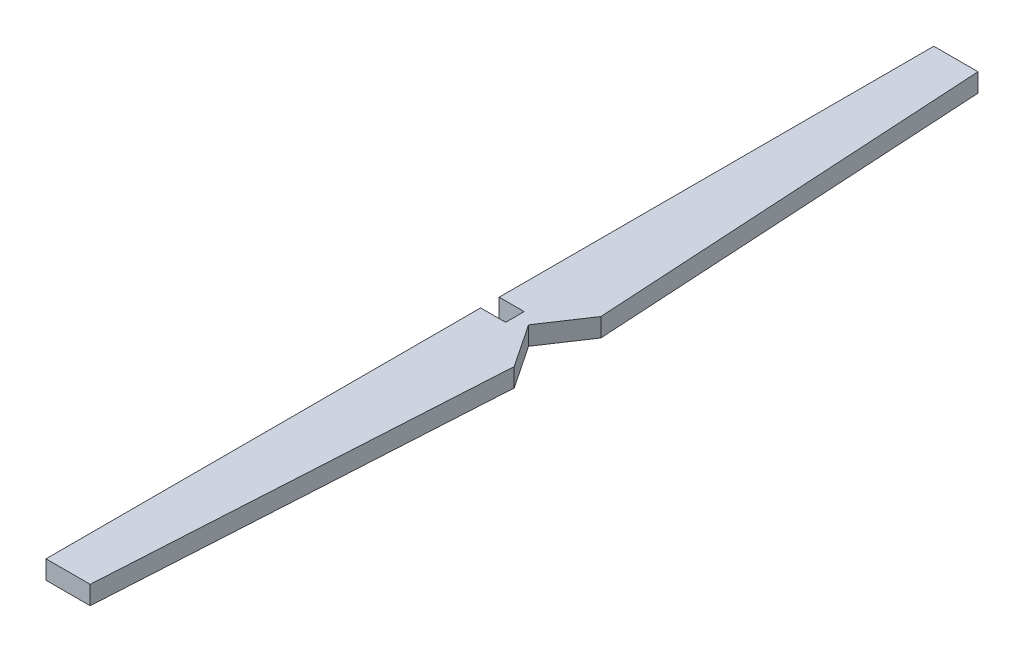
ISO-10303-21;
HEADER;
FILE_DESCRIPTION(('STEP AP214'),'2;1');
FILE_NAME('part.step','',(''),(''),'','','');
FILE_SCHEMA(('AUTOMOTIVE_DESIGN { 1 0 10303 214 1 1 1 1 }'));
ENDSEC;
DATA;
#1=APPLICATION_CONTEXT('core data for automotive mechanical design processes');
#2=APPLICATION_PROTOCOL_DEFINITION('international standard','automotive_design',2000,#1);
#3=PRODUCT_CONTEXT('',#1,'mechanical');
#4=PRODUCT('Part','Part','',(#3));
#5=PRODUCT_RELATED_PRODUCT_CATEGORY('part','',(#4));
#6=PRODUCT_DEFINITION_FORMATION('','',#4);
#7=PRODUCT_DEFINITION_CONTEXT('part definition',#1,'design');
#8=PRODUCT_DEFINITION('design','',#6,#7);
#9=PRODUCT_DEFINITION_SHAPE('','',#8);
#10=(LENGTH_UNIT() NAMED_UNIT(*) SI_UNIT(.MILLI.,.METRE.));
#11=(NAMED_UNIT(*) PLANE_ANGLE_UNIT() SI_UNIT($,.RADIAN.));
#12=(NAMED_UNIT(*) SI_UNIT($,.STERADIAN.) SOLID_ANGLE_UNIT());
#13=UNCERTAINTY_MEASURE_WITH_UNIT(LENGTH_MEASURE(1.E-05),#10,'distance_accuracy_value','');
#14=(GEOMETRIC_REPRESENTATION_CONTEXT(3) GLOBAL_UNCERTAINTY_ASSIGNED_CONTEXT((#13)) GLOBAL_UNIT_ASSIGNED_CONTEXT((#10,
#11,#12)) REPRESENTATION_CONTEXT('',''));
#15=CARTESIAN_POINT('',(0.,0.,0.));
#16=DIRECTION('',(0.,0.,1.));
#17=DIRECTION('',(1.,0.,0.));
#18=AXIS2_PLACEMENT_3D('',#15,#16,#17);
#19=CARTESIAN_POINT('',(9.16879593763161,12.,215.01));
#20=DIRECTION('',(1.,0.,0.));
#21=DIRECTION('',(0.,0.,-1.));
#22=AXIS2_PLACEMENT_3D('',#19,#20,#21);
#23=PLANE('',#22);
#24=DIRECTION('',(0.,0.,1.));
#25=VECTOR('',#24,1.);
#26=CARTESIAN_POINT('',(9.16879593763161,3.,215.01));
#27=LINE('',#26,#25);
#28=CARTESIAN_POINT('',(9.16879593763169,3.,4.5));
#29=VERTEX_POINT('',#28);
#30=CARTESIAN_POINT('',(9.16879593763161,3.,215.01));
#31=VERTEX_POINT('',#30);
#32=EDGE_CURVE('E149',#29,#31,#27,.T.);
#33=ORIENTED_EDGE('',*,*,#32,.T.);
#34=DIRECTION('',(0.,-1.,0.));
#35=VECTOR('',#34,1.);
#36=CARTESIAN_POINT('',(9.16879593763161,12.,215.01));
#37=LINE('',#36,#35);
#38=CARTESIAN_POINT('',(9.16879593763161,12.,215.01));
#39=VERTEX_POINT('',#38);
#40=EDGE_CURVE('E11',#39,#31,#37,.T.);
#41=ORIENTED_EDGE('',*,*,#40,.F.);
#42=DIRECTION('',(0.,0.,1.));
#43=VECTOR('',#42,1.);
#44=CARTESIAN_POINT('',(9.16879593763161,12.,215.01));
#45=LINE('',#44,#43);
#46=CARTESIAN_POINT('',(9.16879593763169,12.,4.5));
#47=VERTEX_POINT('',#46);
#48=EDGE_CURVE('E169',#47,#39,#45,.T.);
#49=ORIENTED_EDGE('',*,*,#48,.F.);
#50=DIRECTION('',(0.,-1.,0.));
#51=VECTOR('',#50,1.);
#52=CARTESIAN_POINT('',(9.16879593763169,12.,4.5));
#53=LINE('',#52,#51);
#54=EDGE_CURVE('E145',#47,#29,#53,.T.);
#55=ORIENTED_EDGE('',*,*,#54,.T.);
#56=EDGE_LOOP('',(#33,#41,#49,#55));
#57=FACE_BOUND('',#56,.T.);
#58=ADVANCED_FACE('F35',(#57),#23,.F.);
#59=CARTESIAN_POINT('',(30.5591561434636,12.,215.01));
#60=DIRECTION('',(0.,0.,-1.));
#61=DIRECTION('',(-1.,0.,0.));
#62=AXIS2_PLACEMENT_3D('',#59,#60,#61);
#63=PLANE('',#62);
#64=DIRECTION('',(1.,0.,0.));
#65=VECTOR('',#64,1.);
#66=CARTESIAN_POINT('',(30.5591561434636,3.,215.01));
#67=LINE('',#66,#65);
#68=CARTESIAN_POINT('',(30.5591561434636,3.,215.01));
#69=VERTEX_POINT('',#68);
#70=EDGE_CURVE('E152',#31,#69,#67,.T.);
#71=ORIENTED_EDGE('',*,*,#70,.T.);
#72=DIRECTION('',(0.,-1.,0.));
#73=VECTOR('',#72,1.);
#74=CARTESIAN_POINT('',(30.5591561434636,12.,215.01));
#75=LINE('',#74,#73);
#76=CARTESIAN_POINT('',(30.5591561434636,12.,215.01));
#77=VERTEX_POINT('',#76);
#78=EDGE_CURVE('E43',#77,#69,#75,.T.);
#79=ORIENTED_EDGE('',*,*,#78,.F.);
#80=DIRECTION('',(1.,0.,0.));
#81=VECTOR('',#80,1.);
#82=CARTESIAN_POINT('',(30.5591561434636,12.,215.01));
#83=LINE('',#82,#81);
#84=EDGE_CURVE('E103',#39,#77,#83,.T.);
#85=ORIENTED_EDGE('',*,*,#84,.F.);
#86=ORIENTED_EDGE('',*,*,#40,.T.);
#87=EDGE_LOOP('',(#71,#79,#85,#86));
#88=FACE_BOUND('',#87,.T.);
#89=ADVANCED_FACE('F241',(#88),#63,.F.);
#90=CARTESIAN_POINT('',(41.9122959785608,12.,20.9987605360466));
#91=DIRECTION('',(-0.998292209621749,0.,-0.0584180127060611));
#92=DIRECTION('',(-0.0584180127060611,0.,0.998292209621749));
#93=AXIS2_PLACEMENT_3D('',#90,#91,#92);
#94=PLANE('',#93);
#95=DIRECTION('',(0.0584180127060611,0.,-0.998292209621749));
#96=VECTOR('',#95,1.);
#97=CARTESIAN_POINT('',(41.9122959785608,3.,20.9987605360466));
#98=LINE('',#97,#96);
#99=CARTESIAN_POINT('',(41.9122959785608,3.,20.9987605360466));
#100=VERTEX_POINT('',#99);
#101=EDGE_CURVE('E154',#69,#100,#98,.T.);
#102=ORIENTED_EDGE('',*,*,#101,.T.);
#103=DIRECTION('',(0.,-1.,0.));
#104=VECTOR('',#103,1.);
#105=CARTESIAN_POINT('',(41.9122959785608,12.,20.9987605360466));
#106=LINE('',#105,#104);
#107=CARTESIAN_POINT('',(41.9122959785608,12.,20.9987605360466));
#108=VERTEX_POINT('',#107);
#109=EDGE_CURVE('E185',#108,#100,#106,.T.);
#110=ORIENTED_EDGE('',*,*,#109,.F.);
#111=DIRECTION('',(0.0584180127060611,0.,-0.998292209621749));
#112=VECTOR('',#111,1.);
#113=CARTESIAN_POINT('',(41.9122959785608,12.,20.9987605360466));
#114=LINE('',#113,#112);
#115=EDGE_CURVE('E193',#77,#108,#114,.T.);
#116=ORIENTED_EDGE('',*,*,#115,.F.);
#117=ORIENTED_EDGE('',*,*,#78,.T.);
#118=EDGE_LOOP('',(#102,#110,#116,#117));
#119=FACE_BOUND('',#118,.T.);
#120=ADVANCED_FACE('F191',(#119),#94,.F.);
#121=CARTESIAN_POINT('',(41.9122959785608,12.,20.9987605360466));
#122=DIRECTION('',(-0.83156761778236,0.,0.555423529440167));
#123=DIRECTION('',(0.555423529440167,0.,0.83156761778236));
#124=AXIS2_PLACEMENT_3D('',#121,#122,#123);
#125=PLANE('',#124);
#126=DIRECTION('',(-0.555423529440167,0.,-0.83156761778236));
#127=VECTOR('',#126,1.);
#128=CARTESIAN_POINT('',(41.9122959785608,3.,20.9987605360466));
#129=LINE('',#128,#127);
#130=CARTESIAN_POINT('',(27.8867309596829,3.,0.));
#131=VERTEX_POINT('',#130);
#132=EDGE_CURVE('E156',#100,#131,#129,.T.);
#133=ORIENTED_EDGE('',*,*,#132,.T.);
#134=DIRECTION('',(0.,-1.,0.));
#135=VECTOR('',#134,1.);
#136=CARTESIAN_POINT('',(27.8867309596829,12.,0.));
#137=LINE('',#136,#135);
#138=CARTESIAN_POINT('',(27.8867309596829,12.,0.));
#139=VERTEX_POINT('',#138);
#140=EDGE_CURVE('E182',#139,#131,#137,.T.);
#141=ORIENTED_EDGE('',*,*,#140,.F.);
#142=DIRECTION('',(-0.555423529440167,0.,-0.83156761778236));
#143=VECTOR('',#142,1.);
#144=CARTESIAN_POINT('',(41.9122959785608,12.,20.9987605360466));
#145=LINE('',#144,#143);
#146=EDGE_CURVE('E211',#108,#139,#145,.T.);
#147=ORIENTED_EDGE('',*,*,#146,.F.);
#148=ORIENTED_EDGE('',*,*,#109,.T.);
#149=EDGE_LOOP('',(#133,#141,#147,#148));
#150=FACE_BOUND('',#149,.T.);
#151=ADVANCED_FACE('F202',(#150),#125,.F.);
#152=CARTESIAN_POINT('',(41.9122959785608,12.,-20.9987605360466));
#153=DIRECTION('',(-0.83156761778236,0.,-0.555423529440167));
#154=DIRECTION('',(-0.555423529440167,0.,0.83156761778236));
#155=AXIS2_PLACEMENT_3D('',#152,#153,#154);
#156=PLANE('',#155);
#157=DIRECTION('',(0.555423529440167,0.,-0.83156761778236));
#158=VECTOR('',#157,1.);
#159=CARTESIAN_POINT('',(41.9122959785608,3.,-20.9987605360466));
#160=LINE('',#159,#158);
#161=CARTESIAN_POINT('',(41.9122959785608,3.,-20.9987605360466));
#162=VERTEX_POINT('',#161);
#163=EDGE_CURVE('E158',#131,#162,#160,.T.);
#164=ORIENTED_EDGE('',*,*,#163,.T.);
#165=DIRECTION('',(0.,-1.,0.));
#166=VECTOR('',#165,1.);
#167=CARTESIAN_POINT('',(41.9122959785608,12.,-20.9987605360466));
#168=LINE('',#167,#166);
#169=CARTESIAN_POINT('',(41.9122959785608,12.,-20.9987605360466));
#170=VERTEX_POINT('',#169);
#171=EDGE_CURVE('E179',#170,#162,#168,.T.);
#172=ORIENTED_EDGE('',*,*,#171,.F.);
#173=DIRECTION('',(0.555423529440167,0.,-0.83156761778236));
#174=VECTOR('',#173,1.);
#175=CARTESIAN_POINT('',(41.9122959785608,12.,-20.9987605360466));
#176=LINE('',#175,#174);
#177=EDGE_CURVE('E208',#139,#170,#176,.T.);
#178=ORIENTED_EDGE('',*,*,#177,.F.);
#179=ORIENTED_EDGE('',*,*,#140,.T.);
#180=EDGE_LOOP('',(#164,#172,#178,#179));
#181=FACE_BOUND('',#180,.T.);
#182=ADVANCED_FACE('F206',(#181),#156,.F.);
#183=CARTESIAN_POINT('',(41.9122959785608,12.,-20.9987605360466));
#184=DIRECTION('',(-0.998292209621749,0.,0.0584180127060611));
#185=DIRECTION('',(0.0584180127060611,0.,0.998292209621749));
#186=AXIS2_PLACEMENT_3D('',#183,#184,#185);
#187=PLANE('',#186);
#188=DIRECTION('',(-0.0584180127060611,0.,-0.998292209621749));
#189=VECTOR('',#188,1.);
#190=CARTESIAN_POINT('',(41.9122959785608,3.,-20.9987605360466));
#191=LINE('',#190,#189);
#192=CARTESIAN_POINT('',(30.5591561434636,3.,-215.01));
#193=VERTEX_POINT('',#192);
#194=EDGE_CURVE('E160',#162,#193,#191,.T.);
#195=ORIENTED_EDGE('',*,*,#194,.T.);
#196=DIRECTION('',(0.,-1.,0.));
#197=VECTOR('',#196,1.);
#198=CARTESIAN_POINT('',(30.5591561434636,12.,-215.01));
#199=LINE('',#198,#197);
#200=CARTESIAN_POINT('',(30.5591561434636,12.,-215.01));
#201=VERTEX_POINT('',#200);
#202=EDGE_CURVE('E176',#201,#193,#199,.T.);
#203=ORIENTED_EDGE('',*,*,#202,.F.);
#204=DIRECTION('',(-0.0584180127060611,0.,-0.998292209621749));
#205=VECTOR('',#204,1.);
#206=CARTESIAN_POINT('',(41.9122959785608,12.,-20.9987605360466));
#207=LINE('',#206,#205);
#208=EDGE_CURVE('E210',#170,#201,#207,.T.);
#209=ORIENTED_EDGE('',*,*,#208,.F.);
#210=ORIENTED_EDGE('',*,*,#171,.T.);
#211=EDGE_LOOP('',(#195,#203,#209,#210));
#212=FACE_BOUND('',#211,.T.);
#213=ADVANCED_FACE('F254',(#212),#187,.F.);
#214=CARTESIAN_POINT('',(30.5591561434636,12.,-215.01));
#215=DIRECTION('',(0.,0.,1.));
#216=DIRECTION('',(1.,0.,0.));
#217=AXIS2_PLACEMENT_3D('',#214,#215,#216);
#218=PLANE('',#217);
#219=DIRECTION('',(-1.,0.,0.));
#220=VECTOR('',#219,1.);
#221=CARTESIAN_POINT('',(30.5591561434636,3.,-215.01));
#222=LINE('',#221,#220);
#223=CARTESIAN_POINT('',(9.16879593763161,3.,-215.01));
#224=VERTEX_POINT('',#223);
#225=EDGE_CURVE('E162',#193,#224,#222,.T.);
#226=ORIENTED_EDGE('',*,*,#225,.T.);
#227=DIRECTION('',(0.,-1.,0.));
#228=VECTOR('',#227,1.);
#229=CARTESIAN_POINT('',(9.16879593763161,12.,-215.01));
#230=LINE('',#229,#228);
#231=CARTESIAN_POINT('',(9.16879593763161,12.,-215.01));
#232=VERTEX_POINT('',#231);
#233=EDGE_CURVE('E173',#232,#224,#230,.T.);
#234=ORIENTED_EDGE('',*,*,#233,.F.);
#235=DIRECTION('',(-1.,0.,0.));
#236=VECTOR('',#235,1.);
#237=CARTESIAN_POINT('',(30.5591561434636,12.,-215.01));
#238=LINE('',#237,#236);
#239=EDGE_CURVE('E213',#201,#232,#238,.T.);
#240=ORIENTED_EDGE('',*,*,#239,.F.);
#241=ORIENTED_EDGE('',*,*,#202,.T.);
#242=EDGE_LOOP('',(#226,#234,#240,#241));
#243=FACE_BOUND('',#242,.T.);
#244=ADVANCED_FACE('F222',(#243),#218,.F.);
#245=CARTESIAN_POINT('',(9.16879593763161,12.,-215.01));
#246=DIRECTION('',(1.,0.,0.));
#247=DIRECTION('',(0.,0.,-1.));
#248=AXIS2_PLACEMENT_3D('',#245,#246,#247);
#249=PLANE('',#248);
#250=DIRECTION('',(0.,0.,1.));
#251=VECTOR('',#250,1.);
#252=CARTESIAN_POINT('',(9.16879593763161,3.,-215.01));
#253=LINE('',#252,#251);
#254=CARTESIAN_POINT('',(9.16879593763169,3.,-4.5));
#255=VERTEX_POINT('',#254);
#256=EDGE_CURVE('E164',#224,#255,#253,.T.);
#257=ORIENTED_EDGE('',*,*,#256,.T.);
#258=DIRECTION('',(0.,-1.,0.));
#259=VECTOR('',#258,1.);
#260=CARTESIAN_POINT('',(9.16879593763169,12.,-4.5));
#261=LINE('',#260,#259);
#262=CARTESIAN_POINT('',(9.16879593763169,12.,-4.5));
#263=VERTEX_POINT('',#262);
#264=EDGE_CURVE('E140',#263,#255,#261,.T.);
#265=ORIENTED_EDGE('',*,*,#264,.F.);
#266=DIRECTION('',(0.,0.,1.));
#267=VECTOR('',#266,1.);
#268=CARTESIAN_POINT('',(9.16879593763161,12.,-215.01));
#269=LINE('',#268,#267);
#270=EDGE_CURVE('E131',#232,#263,#269,.T.);
#271=ORIENTED_EDGE('',*,*,#270,.F.);
#272=ORIENTED_EDGE('',*,*,#233,.T.);
#273=EDGE_LOOP('',(#257,#265,#271,#272));
#274=FACE_BOUND('',#273,.T.);
#275=ADVANCED_FACE('F226',(#274),#249,.F.);
#276=CARTESIAN_POINT('',(9.16879593763169,12.,-4.5));
#277=DIRECTION('',(0.,0.,-1.));
#278=DIRECTION('',(-1.,0.,0.));
#279=AXIS2_PLACEMENT_3D('',#276,#277,#278);
#280=PLANE('',#279);
#281=DIRECTION('',(1.,0.,0.));
#282=VECTOR('',#281,1.);
#283=CARTESIAN_POINT('',(9.16879593763169,3.,-4.5));
#284=LINE('',#283,#282);
#285=CARTESIAN_POINT('',(21.2770386740625,3.,-4.5));
#286=VERTEX_POINT('',#285);
#287=EDGE_CURVE('E139',#255,#286,#284,.T.);
#288=ORIENTED_EDGE('',*,*,#287,.T.);
#289=DIRECTION('',(0.,-1.,0.));
#290=VECTOR('',#289,1.);
#291=CARTESIAN_POINT('',(21.2770386740625,12.,-4.5));
#292=LINE('',#291,#290);
#293=CARTESIAN_POINT('',(21.2770386740625,12.,-4.5));
#294=VERTEX_POINT('',#293);
#295=EDGE_CURVE('E136',#294,#286,#292,.T.);
#296=ORIENTED_EDGE('',*,*,#295,.F.);
#297=DIRECTION('',(1.,0.,0.));
#298=VECTOR('',#297,1.);
#299=CARTESIAN_POINT('',(9.16879593763169,12.,-4.5));
#300=LINE('',#299,#298);
#301=EDGE_CURVE('E125',#263,#294,#300,.T.);
#302=ORIENTED_EDGE('',*,*,#301,.F.);
#303=ORIENTED_EDGE('',*,*,#264,.T.);
#304=EDGE_LOOP('',(#288,#296,#302,#303));
#305=FACE_BOUND('',#304,.T.);
#306=ADVANCED_FACE('F137',(#305),#280,.F.);
#307=CARTESIAN_POINT('',(21.2770386740625,12.,-4.5));
#308=DIRECTION('',(1.,0.,0.));
#309=DIRECTION('',(0.,0.,-1.));
#310=AXIS2_PLACEMENT_3D('',#307,#308,#309);
#311=PLANE('',#310);
#312=DIRECTION('',(0.,0.,1.));
#313=VECTOR('',#312,1.);
#314=CARTESIAN_POINT('',(21.2770386740625,3.,-4.5));
#315=LINE('',#314,#313);
#316=CARTESIAN_POINT('',(21.2770386740625,3.,4.5));
#317=VERTEX_POINT('',#316);
#318=EDGE_CURVE('E89',#286,#317,#315,.T.);
#319=ORIENTED_EDGE('',*,*,#318,.T.);
#320=DIRECTION('',(0.,-1.,0.));
#321=VECTOR('',#320,1.);
#322=CARTESIAN_POINT('',(21.2770386740625,12.,4.5));
#323=LINE('',#322,#321);
#324=CARTESIAN_POINT('',(21.2770386740625,12.,4.5));
#325=VERTEX_POINT('',#324);
#326=EDGE_CURVE('E141',#325,#317,#323,.T.);
#327=ORIENTED_EDGE('',*,*,#326,.F.);
#328=DIRECTION('',(0.,0.,1.));
#329=VECTOR('',#328,1.);
#330=CARTESIAN_POINT('',(21.2770386740625,12.,-4.5));
#331=LINE('',#330,#329);
#332=EDGE_CURVE('E129',#294,#325,#331,.T.);
#333=ORIENTED_EDGE('',*,*,#332,.F.);
#334=ORIENTED_EDGE('',*,*,#295,.T.);
#335=EDGE_LOOP('',(#319,#327,#333,#334));
#336=FACE_BOUND('',#335,.T.);
#337=ADVANCED_FACE('F143',(#336),#311,.F.);
#338=CARTESIAN_POINT('',(9.16879593763169,12.,4.5));
#339=DIRECTION('',(0.,0.,1.));
#340=DIRECTION('',(1.,0.,0.));
#341=AXIS2_PLACEMENT_3D('',#338,#339,#340);
#342=PLANE('',#341);
#343=DIRECTION('',(-1.,0.,0.));
#344=VECTOR('',#343,1.);
#345=CARTESIAN_POINT('',(9.16879593763169,3.,4.5));
#346=LINE('',#345,#344);
#347=EDGE_CURVE('E95',#317,#29,#346,.T.);
#348=ORIENTED_EDGE('',*,*,#347,.T.);
#349=ORIENTED_EDGE('',*,*,#54,.F.);
#350=DIRECTION('',(-1.,0.,0.));
#351=VECTOR('',#350,1.);
#352=CARTESIAN_POINT('',(9.16879593763169,12.,4.5));
#353=LINE('',#352,#351);
#354=EDGE_CURVE('E51',#325,#47,#353,.T.);
#355=ORIENTED_EDGE('',*,*,#354,.F.);
#356=ORIENTED_EDGE('',*,*,#326,.T.);
#357=EDGE_LOOP('',(#348,#349,#355,#356));
#358=FACE_BOUND('',#357,.T.);
#359=ADVANCED_FACE('F230',(#358),#342,.F.);
#360=CARTESIAN_POINT('',(9.16879593763161,12.,0.));
#361=DIRECTION('',(0.,-1.,0.));
#362=DIRECTION('',(0.,0.,-1.));
#363=AXIS2_PLACEMENT_3D('',#360,#361,#362);
#364=PLANE('',#363);
#365=ORIENTED_EDGE('',*,*,#48,.T.);
#366=ORIENTED_EDGE('',*,*,#84,.T.);
#367=ORIENTED_EDGE('',*,*,#115,.T.);
#368=ORIENTED_EDGE('',*,*,#146,.T.);
#369=ORIENTED_EDGE('',*,*,#177,.T.);
#370=ORIENTED_EDGE('',*,*,#208,.T.);
#371=ORIENTED_EDGE('',*,*,#239,.T.);
#372=ORIENTED_EDGE('',*,*,#270,.T.);
#373=ORIENTED_EDGE('',*,*,#301,.T.);
#374=ORIENTED_EDGE('',*,*,#332,.T.);
#375=ORIENTED_EDGE('',*,*,#354,.T.);
#376=EDGE_LOOP('',(#365,#366,#367,#368,#369,#370,#371,#372,#373,#374,#375));
#377=FACE_BOUND('',#376,.T.);
#378=ADVANCED_FACE('F127',(#377),#364,.F.);
#379=CARTESIAN_POINT('',(9.16879593763161,3.,0.));
#380=DIRECTION('',(0.,-1.,0.));
#381=DIRECTION('',(0.,0.,-1.));
#382=AXIS2_PLACEMENT_3D('',#379,#380,#381);
#383=PLANE('',#382);
#384=ORIENTED_EDGE('',*,*,#32,.F.);
#385=ORIENTED_EDGE('',*,*,#347,.F.);
#386=ORIENTED_EDGE('',*,*,#318,.F.);
#387=ORIENTED_EDGE('',*,*,#287,.F.);
#388=ORIENTED_EDGE('',*,*,#256,.F.);
#389=ORIENTED_EDGE('',*,*,#225,.F.);
#390=ORIENTED_EDGE('',*,*,#194,.F.);
#391=ORIENTED_EDGE('',*,*,#163,.F.);
#392=ORIENTED_EDGE('',*,*,#132,.F.);
#393=ORIENTED_EDGE('',*,*,#101,.F.);
#394=ORIENTED_EDGE('',*,*,#70,.F.);
#395=EDGE_LOOP('',(#384,#385,#386,#387,#388,#389,#390,#391,#392,#393,#394));
#396=FACE_BOUND('',#395,.T.);
#397=ADVANCED_FACE('F197',(#396),#383,.T.);
#398=CLOSED_SHELL('',(#58,#89,#120,#151,#182,#213,#244,#275,#306,#337,#359,#378,#397));
#399=MANIFOLD_SOLID_BREP('B2',#398);
#400=ADVANCED_BREP_SHAPE_REPRESENTATION('',(#18,#399),#14);
#401=SHAPE_DEFINITION_REPRESENTATION(#9,#400);
ENDSEC;
END-ISO-10303-21;
